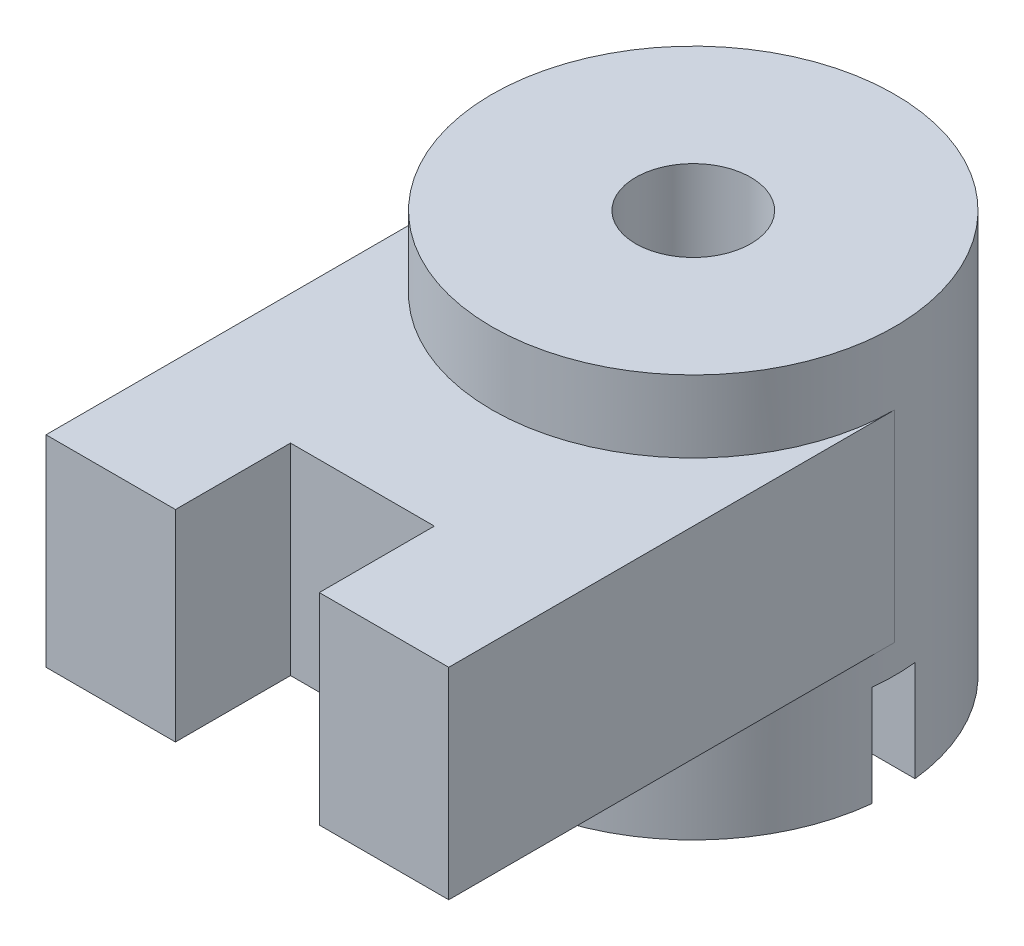
ISO-10303-21;
HEADER;
FILE_DESCRIPTION(('STEP AP214'),'2;1');
FILE_NAME('part.step','',(''),(''),'','','');
FILE_SCHEMA(('AUTOMOTIVE_DESIGN { 1 0 10303 214 1 1 1 1 }'));
ENDSEC;
DATA;
#1=APPLICATION_CONTEXT('core data for automotive mechanical design processes');
#2=APPLICATION_PROTOCOL_DEFINITION('international standard','automotive_design',2000,#1);
#3=PRODUCT_CONTEXT('',#1,'mechanical');
#4=PRODUCT('Part','Part','',(#3));
#5=PRODUCT_RELATED_PRODUCT_CATEGORY('part','',(#4));
#6=PRODUCT_DEFINITION_FORMATION('','',#4);
#7=PRODUCT_DEFINITION_CONTEXT('part definition',#1,'design');
#8=PRODUCT_DEFINITION('design','',#6,#7);
#9=PRODUCT_DEFINITION_SHAPE('','',#8);
#10=(LENGTH_UNIT() NAMED_UNIT(*) SI_UNIT(.MILLI.,.METRE.));
#11=(NAMED_UNIT(*) PLANE_ANGLE_UNIT() SI_UNIT($,.RADIAN.));
#12=(NAMED_UNIT(*) SI_UNIT($,.STERADIAN.) SOLID_ANGLE_UNIT());
#13=UNCERTAINTY_MEASURE_WITH_UNIT(LENGTH_MEASURE(1.E-05),#10,'distance_accuracy_value','');
#14=(GEOMETRIC_REPRESENTATION_CONTEXT(3) GLOBAL_UNCERTAINTY_ASSIGNED_CONTEXT((#13)) GLOBAL_UNIT_ASSIGNED_CONTEXT((#10,
#11,#12)) REPRESENTATION_CONTEXT('',''));
#15=CARTESIAN_POINT('',(0.,0.,0.));
#16=DIRECTION('',(0.,0.,1.));
#17=DIRECTION('',(1.,0.,0.));
#18=AXIS2_PLACEMENT_3D('',#15,#16,#17);
#19=CARTESIAN_POINT('',(70.,0.,155.));
#20=DIRECTION('',(0.,0.,1.));
#21=DIRECTION('',(0.,-1.,0.));
#22=AXIS2_PLACEMENT_3D('',#19,#20,#21);
#23=PLANE('',#22);
#24=DIRECTION('',(0.,1.,0.));
#25=VECTOR('',#24,1.);
#26=CARTESIAN_POINT('',(25.,0.,155.));
#27=LINE('',#26,#25);
#28=CARTESIAN_POINT('',(25.,45.,155.));
#29=VERTEX_POINT('',#28);
#30=CARTESIAN_POINT('',(25.,115.,155.));
#31=VERTEX_POINT('',#30);
#32=EDGE_CURVE('E42',#29,#31,#27,.T.);
#33=ORIENTED_EDGE('',*,*,#32,.F.);
#34=DIRECTION('',(-1.,0.,0.));
#35=VECTOR('',#34,1.);
#36=CARTESIAN_POINT('',(70.,45.,155.));
#37=LINE('',#36,#35);
#38=CARTESIAN_POINT('',(70.,45.,155.));
#39=VERTEX_POINT('',#38);
#40=EDGE_CURVE('E194',#39,#29,#37,.T.);
#41=ORIENTED_EDGE('',*,*,#40,.F.);
#42=DIRECTION('',(0.,1.,0.));
#43=VECTOR('',#42,1.);
#44=CARTESIAN_POINT('',(70.,0.,155.));
#45=LINE('',#44,#43);
#46=CARTESIAN_POINT('',(70.,115.,155.));
#47=VERTEX_POINT('',#46);
#48=EDGE_CURVE('E183',#39,#47,#45,.T.);
#49=ORIENTED_EDGE('',*,*,#48,.T.);
#50=DIRECTION('',(-1.,0.,0.));
#51=VECTOR('',#50,1.);
#52=CARTESIAN_POINT('',(70.,115.,155.));
#53=LINE('',#52,#51);
#54=EDGE_CURVE('E197',#47,#31,#53,.T.);
#55=ORIENTED_EDGE('',*,*,#54,.T.);
#56=EDGE_LOOP('',(#33,#41,#49,#55));
#57=FACE_BOUND('',#56,.T.);
#58=ADVANCED_FACE('F34',(#57),#23,.T.);
#59=CARTESIAN_POINT('',(0.,140.,0.));
#60=DIRECTION('',(0.,-1.,0.));
#61=DIRECTION('',(0.,0.,-1.));
#62=AXIS2_PLACEMENT_3D('',#59,#60,#61);
#63=CYLINDRICAL_SURFACE('',#62,70.);
#64=CARTESIAN_POINT('',(0.,0.,0.));
#65=DIRECTION('',(0.,1.,0.));
#66=DIRECTION('',(0.,0.,1.));
#67=AXIS2_PLACEMENT_3D('',#64,#65,#66);
#68=CIRCLE('',#67,70.);
#69=CARTESIAN_POINT('',(-69.5970545353753,0.,7.5));
#70=VERTEX_POINT('',#69);
#71=CARTESIAN_POINT('',(69.5970545353753,0.,7.5));
#72=VERTEX_POINT('',#71);
#73=EDGE_CURVE('E239',#70,#72,#68,.T.);
#74=ORIENTED_EDGE('',*,*,#73,.T.);
#75=DIRECTION('',(0.,-1.,0.));
#76=VECTOR('',#75,1.);
#77=CARTESIAN_POINT('',(69.5970545353753,140.,7.50000000000003));
#78=LINE('',#77,#76);
#79=CARTESIAN_POINT('',(69.5970545353753,35.,7.50000000000001));
#80=VERTEX_POINT('',#79);
#81=EDGE_CURVE('E218',#72,#80,#78,.F.);
#82=ORIENTED_EDGE('',*,*,#81,.T.);
#83=CARTESIAN_POINT('',(0.,35.,0.));
#84=DIRECTION('',(0.,1.,0.));
#85=DIRECTION('',(0.,0.,1.));
#86=AXIS2_PLACEMENT_3D('',#83,#84,#85);
#87=CIRCLE('',#86,70.);
#88=CARTESIAN_POINT('',(69.5970545353753,35.,-7.49999999999999));
#89=VERTEX_POINT('',#88);
#90=EDGE_CURVE('E212',#80,#89,#87,.T.);
#91=ORIENTED_EDGE('',*,*,#90,.T.);
#92=DIRECTION('',(0.,-1.,0.));
#93=VECTOR('',#92,1.);
#94=CARTESIAN_POINT('',(69.5970545353753,140.,-7.49999999999997));
#95=LINE('',#94,#93);
#96=CARTESIAN_POINT('',(69.5970545353753,0.,-7.5));
#97=VERTEX_POINT('',#96);
#98=EDGE_CURVE('E232',#89,#97,#95,.T.);
#99=ORIENTED_EDGE('',*,*,#98,.T.);
#100=CARTESIAN_POINT('',(-69.5970545353753,0.,-7.5));
#101=VERTEX_POINT('',#100);
#102=EDGE_CURVE('E247',#97,#101,#68,.T.);
#103=ORIENTED_EDGE('',*,*,#102,.T.);
#104=DIRECTION('',(0.,-1.,0.));
#105=VECTOR('',#104,1.);
#106=CARTESIAN_POINT('',(-69.5970545353753,140.,-7.49999999999997));
#107=LINE('',#106,#105);
#108=CARTESIAN_POINT('',(-69.5970545353753,35.,-7.49999999999999));
#109=VERTEX_POINT('',#108);
#110=EDGE_CURVE('E228',#101,#109,#107,.F.);
#111=ORIENTED_EDGE('',*,*,#110,.T.);
#112=CARTESIAN_POINT('',(-69.5970545353753,35.,7.50000000000001));
#113=VERTEX_POINT('',#112);
#114=EDGE_CURVE('E215',#109,#113,#87,.T.);
#115=ORIENTED_EDGE('',*,*,#114,.T.);
#116=DIRECTION('',(0.,-1.,0.));
#117=VECTOR('',#116,1.);
#118=CARTESIAN_POINT('',(-69.5970545353753,140.,7.50000000000003));
#119=LINE('',#118,#117);
#120=EDGE_CURVE('E222',#113,#70,#119,.T.);
#121=ORIENTED_EDGE('',*,*,#120,.T.);
#122=EDGE_LOOP('',(#74,#82,#91,#99,#103,#111,#115,#121));
#123=FACE_BOUND('',#122,.T.);
#124=CARTESIAN_POINT('',(0.,140.,0.));
#125=DIRECTION('',(0.,1.,0.));
#126=DIRECTION('',(0.,0.,1.));
#127=AXIS2_PLACEMENT_3D('',#124,#125,#126);
#128=CIRCLE('',#127,70.);
#129=CARTESIAN_POINT('',(0.,140.,70.));
#130=VERTEX_POINT('',#129);
#131=EDGE_CURVE('E243',#130,#130,#128,.T.);
#132=ORIENTED_EDGE('',*,*,#131,.F.);
#133=EDGE_LOOP('',(#132));
#134=FACE_BOUND('',#133,.T.);
#135=CARTESIAN_POINT('',(0.,45.,0.));
#136=DIRECTION('',(0.,1.,0.));
#137=DIRECTION('',(0.,0.,1.));
#138=AXIS2_PLACEMENT_3D('',#135,#136,#137);
#139=CIRCLE('',#138,70.);
#140=CARTESIAN_POINT('',(-70.,45.,0.));
#141=VERTEX_POINT('',#140);
#142=CARTESIAN_POINT('',(70.,45.,0.));
#143=VERTEX_POINT('',#142);
#144=EDGE_CURVE('E202',#141,#143,#139,.T.);
#145=ORIENTED_EDGE('',*,*,#144,.F.);
#146=DIRECTION('',(0.,-1.,0.));
#147=VECTOR('',#146,1.);
#148=CARTESIAN_POINT('',(-70.,0.,0.));
#149=LINE('',#148,#147);
#150=CARTESIAN_POINT('',(-70.,115.,0.));
#151=VERTEX_POINT('',#150);
#152=EDGE_CURVE('E170',#151,#141,#149,.T.);
#153=ORIENTED_EDGE('',*,*,#152,.F.);
#154=CARTESIAN_POINT('',(0.,115.,0.));
#155=DIRECTION('',(0.,1.,0.));
#156=DIRECTION('',(0.,0.,1.));
#157=AXIS2_PLACEMENT_3D('',#154,#155,#156);
#158=CIRCLE('',#157,70.);
#159=CARTESIAN_POINT('',(70.,115.,0.));
#160=VERTEX_POINT('',#159);
#161=EDGE_CURVE('E200',#151,#160,#158,.T.);
#162=ORIENTED_EDGE('',*,*,#161,.T.);
#163=DIRECTION('',(0.,-1.,0.));
#164=VECTOR('',#163,1.);
#165=CARTESIAN_POINT('',(70.,0.,0.));
#166=LINE('',#165,#164);
#167=EDGE_CURVE('E57',#160,#143,#166,.T.);
#168=ORIENTED_EDGE('',*,*,#167,.T.);
#169=EDGE_LOOP('',(#145,#153,#162,#168));
#170=FACE_BOUND('',#169,.T.);
#171=ADVANCED_FACE('F36',(#123,#134,#170),#63,.T.);
#172=CARTESIAN_POINT('',(0.,140.,0.));
#173=DIRECTION('',(0.,-1.,0.));
#174=DIRECTION('',(0.,0.,-1.));
#175=AXIS2_PLACEMENT_3D('',#172,#173,#174);
#176=CYLINDRICAL_SURFACE('',#175,20.);
#177=DIRECTION('',(0.,-1.,0.));
#178=VECTOR('',#177,1.);
#179=CARTESIAN_POINT('',(18.5404962177392,140.,-7.49999999999997));
#180=LINE('',#179,#178);
#181=CARTESIAN_POINT('',(18.5404962177392,35.,-7.49999999999999));
#182=VERTEX_POINT('',#181);
#183=CARTESIAN_POINT('',(18.5404962177392,0.,-7.49999999999997));
#184=VERTEX_POINT('',#183);
#185=EDGE_CURVE('E260',#182,#184,#180,.T.);
#186=ORIENTED_EDGE('',*,*,#185,.F.);
#187=CARTESIAN_POINT('',(0.,35.,0.));
#188=DIRECTION('',(0.,1.,0.));
#189=DIRECTION('',(0.,0.,1.));
#190=AXIS2_PLACEMENT_3D('',#187,#188,#189);
#191=CIRCLE('',#190,20.);
#192=CARTESIAN_POINT('',(18.5404962177392,35.,7.50000000000001));
#193=VERTEX_POINT('',#192);
#194=EDGE_CURVE('E252',#193,#182,#191,.T.);
#195=ORIENTED_EDGE('',*,*,#194,.F.);
#196=DIRECTION('',(0.,-1.,0.));
#197=VECTOR('',#196,1.);
#198=CARTESIAN_POINT('',(18.5404962177391,140.,7.50000000000003));
#199=LINE('',#198,#197);
#200=CARTESIAN_POINT('',(18.5404962177391,0.,7.50000000000003));
#201=VERTEX_POINT('',#200);
#202=EDGE_CURVE('E257',#201,#193,#199,.F.);
#203=ORIENTED_EDGE('',*,*,#202,.F.);
#204=CARTESIAN_POINT('',(0.,0.,0.));
#205=DIRECTION('',(0.,1.,0.));
#206=DIRECTION('',(0.,0.,1.));
#207=AXIS2_PLACEMENT_3D('',#204,#205,#206);
#208=CIRCLE('',#207,20.);
#209=CARTESIAN_POINT('',(-18.5404962177391,0.,7.50000000000003));
#210=VERTEX_POINT('',#209);
#211=EDGE_CURVE('E235',#210,#201,#208,.T.);
#212=ORIENTED_EDGE('',*,*,#211,.F.);
#213=DIRECTION('',(0.,-1.,0.));
#214=VECTOR('',#213,1.);
#215=CARTESIAN_POINT('',(-18.5404962177391,140.,7.50000000000003));
#216=LINE('',#215,#214);
#217=CARTESIAN_POINT('',(-18.5404962177392,35.,7.50000000000001));
#218=VERTEX_POINT('',#217);
#219=EDGE_CURVE('E251',#218,#210,#216,.T.);
#220=ORIENTED_EDGE('',*,*,#219,.F.);
#221=CARTESIAN_POINT('',(-18.5404962177392,35.,-7.49999999999999));
#222=VERTEX_POINT('',#221);
#223=EDGE_CURVE('E246',#222,#218,#191,.T.);
#224=ORIENTED_EDGE('',*,*,#223,.F.);
#225=DIRECTION('',(0.,-1.,0.));
#226=VECTOR('',#225,1.);
#227=CARTESIAN_POINT('',(-18.5404962177392,140.,-7.49999999999997));
#228=LINE('',#227,#226);
#229=CARTESIAN_POINT('',(-18.5404962177392,0.,-7.49999999999997));
#230=VERTEX_POINT('',#229);
#231=EDGE_CURVE('E254',#230,#222,#228,.F.);
#232=ORIENTED_EDGE('',*,*,#231,.F.);
#233=EDGE_CURVE('E240',#184,#230,#208,.T.);
#234=ORIENTED_EDGE('',*,*,#233,.F.);
#235=EDGE_LOOP('',(#186,#195,#203,#212,#220,#224,#232,#234));
#236=FACE_BOUND('',#235,.T.);
#237=CARTESIAN_POINT('',(0.,140.,0.));
#238=DIRECTION('',(0.,1.,0.));
#239=DIRECTION('',(0.,0.,1.));
#240=AXIS2_PLACEMENT_3D('',#237,#238,#239);
#241=CIRCLE('',#240,20.);
#242=CARTESIAN_POINT('',(0.,140.,20.));
#243=VERTEX_POINT('',#242);
#244=EDGE_CURVE('E236',#243,#243,#241,.T.);
#245=ORIENTED_EDGE('',*,*,#244,.T.);
#246=EDGE_LOOP('',(#245));
#247=FACE_BOUND('',#246,.T.);
#248=ADVANCED_FACE('F286',(#236,#247),#176,.F.);
#249=CARTESIAN_POINT('',(0.,0.,0.));
#250=DIRECTION('',(0.,1.,0.));
#251=DIRECTION('',(0.,0.,1.));
#252=AXIS2_PLACEMENT_3D('',#249,#250,#251);
#253=PLANE('',#252);
#254=ORIENTED_EDGE('',*,*,#102,.F.);
#255=DIRECTION('',(-1.,0.,0.));
#256=VECTOR('',#255,1.);
#257=CARTESIAN_POINT('',(0.,0.,-7.5));
#258=LINE('',#257,#256);
#259=EDGE_CURVE('E229',#97,#184,#258,.T.);
#260=ORIENTED_EDGE('',*,*,#259,.T.);
#261=ORIENTED_EDGE('',*,*,#233,.T.);
#262=EDGE_CURVE('E225',#230,#101,#258,.T.);
#263=ORIENTED_EDGE('',*,*,#262,.T.);
#264=EDGE_LOOP('',(#254,#260,#261,#263));
#265=FACE_BOUND('',#264,.T.);
#266=ADVANCED_FACE('F292',(#265),#253,.F.);
#267=CARTESIAN_POINT('',(0.,140.,0.));
#268=DIRECTION('',(0.,1.,0.));
#269=DIRECTION('',(0.,0.,1.));
#270=AXIS2_PLACEMENT_3D('',#267,#268,#269);
#271=PLANE('',#270);
#272=ORIENTED_EDGE('',*,*,#131,.T.);
#273=EDGE_LOOP('',(#272));
#274=FACE_BOUND('',#273,.T.);
#275=ORIENTED_EDGE('',*,*,#244,.F.);
#276=EDGE_LOOP('',(#275));
#277=FACE_BOUND('',#276,.T.);
#278=ADVANCED_FACE('F300',(#274,#277),#271,.T.);
#279=ORIENTED_EDGE('',*,*,#73,.F.);
#280=DIRECTION('',(1.,0.,0.));
#281=VECTOR('',#280,1.);
#282=CARTESIAN_POINT('',(0.,0.,7.5));
#283=LINE('',#282,#281);
#284=EDGE_CURVE('E219',#70,#210,#283,.T.);
#285=ORIENTED_EDGE('',*,*,#284,.T.);
#286=ORIENTED_EDGE('',*,*,#211,.T.);
#287=EDGE_CURVE('E214',#201,#72,#283,.T.);
#288=ORIENTED_EDGE('',*,*,#287,.T.);
#289=EDGE_LOOP('',(#279,#285,#286,#288));
#290=FACE_BOUND('',#289,.T.);
#291=ADVANCED_FACE('F303',(#290),#253,.F.);
#292=CARTESIAN_POINT('',(-70.,35.,7.50000000000001));
#293=DIRECTION('',(0.,1.,0.));
#294=DIRECTION('',(0.,0.,1.));
#295=AXIS2_PLACEMENT_3D('',#292,#293,#294);
#296=PLANE('',#295);
#297=DIRECTION('',(1.,0.,0.));
#298=VECTOR('',#297,1.);
#299=CARTESIAN_POINT('',(-70.,35.,-7.49999999999999));
#300=LINE('',#299,#298);
#301=EDGE_CURVE('E209',#109,#222,#300,.T.);
#302=ORIENTED_EDGE('',*,*,#301,.T.);
#303=ORIENTED_EDGE('',*,*,#223,.T.);
#304=DIRECTION('',(1.,0.,0.));
#305=VECTOR('',#304,1.);
#306=CARTESIAN_POINT('',(-70.,35.,7.50000000000001));
#307=LINE('',#306,#305);
#308=EDGE_CURVE('E208',#113,#218,#307,.T.);
#309=ORIENTED_EDGE('',*,*,#308,.F.);
#310=ORIENTED_EDGE('',*,*,#114,.F.);
#311=EDGE_LOOP('',(#302,#303,#309,#310));
#312=FACE_BOUND('',#311,.T.);
#313=ADVANCED_FACE('F311',(#312),#296,.F.);
#314=CARTESIAN_POINT('',(-70.,-35.,7.5));
#315=DIRECTION('',(0.,0.,1.));
#316=DIRECTION('',(0.,-1.,0.));
#317=AXIS2_PLACEMENT_3D('',#314,#315,#316);
#318=PLANE('',#317);
#319=ORIENTED_EDGE('',*,*,#308,.T.);
#320=ORIENTED_EDGE('',*,*,#219,.T.);
#321=ORIENTED_EDGE('',*,*,#284,.F.);
#322=ORIENTED_EDGE('',*,*,#120,.F.);
#323=EDGE_LOOP('',(#319,#320,#321,#322));
#324=FACE_BOUND('',#323,.T.);
#325=ADVANCED_FACE('F325',(#324),#318,.F.);
#326=CARTESIAN_POINT('',(-70.,-35.,-7.5));
#327=DIRECTION('',(0.,0.,-1.));
#328=DIRECTION('',(0.,1.,0.));
#329=AXIS2_PLACEMENT_3D('',#326,#327,#328);
#330=PLANE('',#329);
#331=ORIENTED_EDGE('',*,*,#262,.F.);
#332=ORIENTED_EDGE('',*,*,#231,.T.);
#333=ORIENTED_EDGE('',*,*,#301,.F.);
#334=ORIENTED_EDGE('',*,*,#110,.F.);
#335=EDGE_LOOP('',(#331,#332,#333,#334));
#336=FACE_BOUND('',#335,.T.);
#337=ADVANCED_FACE('F319',(#336),#330,.F.);
#338=EDGE_CURVE('E204',#182,#89,#300,.T.);
#339=ORIENTED_EDGE('',*,*,#338,.F.);
#340=ORIENTED_EDGE('',*,*,#185,.T.);
#341=ORIENTED_EDGE('',*,*,#259,.F.);
#342=ORIENTED_EDGE('',*,*,#98,.F.);
#343=EDGE_LOOP('',(#339,#340,#341,#342));
#344=FACE_BOUND('',#343,.T.);
#345=ADVANCED_FACE('F315',(#344),#330,.F.);
#346=ORIENTED_EDGE('',*,*,#287,.F.);
#347=ORIENTED_EDGE('',*,*,#202,.T.);
#348=EDGE_CURVE('E205',#193,#80,#307,.T.);
#349=ORIENTED_EDGE('',*,*,#348,.T.);
#350=ORIENTED_EDGE('',*,*,#81,.F.);
#351=EDGE_LOOP('',(#346,#347,#349,#350));
#352=FACE_BOUND('',#351,.T.);
#353=ADVANCED_FACE('F318',(#352),#318,.F.);
#354=ORIENTED_EDGE('',*,*,#348,.F.);
#355=ORIENTED_EDGE('',*,*,#194,.T.);
#356=ORIENTED_EDGE('',*,*,#338,.T.);
#357=ORIENTED_EDGE('',*,*,#90,.F.);
#358=EDGE_LOOP('',(#354,#355,#356,#357));
#359=FACE_BOUND('',#358,.T.);
#360=ADVANCED_FACE('F321',(#359),#296,.F.);
#361=CARTESIAN_POINT('',(70.,45.,0.));
#362=DIRECTION('',(0.,1.,0.));
#363=DIRECTION('',(0.,0.,1.));
#364=AXIS2_PLACEMENT_3D('',#361,#362,#363);
#365=PLANE('',#364);
#366=ORIENTED_EDGE('',*,*,#40,.T.);
#367=DIRECTION('',(0.,0.,-1.));
#368=VECTOR('',#367,1.);
#369=CARTESIAN_POINT('',(25.,45.,0.));
#370=LINE('',#369,#368);
#371=CARTESIAN_POINT('',(25.,45.,115.));
#372=VERTEX_POINT('',#371);
#373=EDGE_CURVE('E166',#29,#372,#370,.T.);
#374=ORIENTED_EDGE('',*,*,#373,.T.);
#375=DIRECTION('',(-1.,0.,0.));
#376=VECTOR('',#375,1.);
#377=CARTESIAN_POINT('',(70.,45.,115.));
#378=LINE('',#377,#376);
#379=CARTESIAN_POINT('',(-25.,45.,115.));
#380=VERTEX_POINT('',#379);
#381=EDGE_CURVE('E158',#372,#380,#378,.T.);
#382=ORIENTED_EDGE('',*,*,#381,.T.);
#383=DIRECTION('',(0.,0.,1.));
#384=VECTOR('',#383,1.);
#385=CARTESIAN_POINT('',(-25.,45.,0.));
#386=LINE('',#385,#384);
#387=CARTESIAN_POINT('',(-25.,45.,155.));
#388=VERTEX_POINT('',#387);
#389=EDGE_CURVE('E145',#380,#388,#386,.T.);
#390=ORIENTED_EDGE('',*,*,#389,.T.);
#391=CARTESIAN_POINT('',(-70.,45.,155.));
#392=VERTEX_POINT('',#391);
#393=EDGE_CURVE('E185',#388,#392,#37,.T.);
#394=ORIENTED_EDGE('',*,*,#393,.T.);
#395=DIRECTION('',(0.,0.,-1.));
#396=VECTOR('',#395,1.);
#397=CARTESIAN_POINT('',(-70.,45.,0.));
#398=LINE('',#397,#396);
#399=EDGE_CURVE('E167',#392,#141,#398,.T.);
#400=ORIENTED_EDGE('',*,*,#399,.T.);
#401=ORIENTED_EDGE('',*,*,#144,.T.);
#402=DIRECTION('',(0.,0.,-1.));
#403=VECTOR('',#402,1.);
#404=CARTESIAN_POINT('',(70.,45.,0.));
#405=LINE('',#404,#403);
#406=EDGE_CURVE('E175',#39,#143,#405,.T.);
#407=ORIENTED_EDGE('',*,*,#406,.F.);
#408=EDGE_LOOP('',(#366,#374,#382,#390,#394,#400,#401,#407));
#409=FACE_BOUND('',#408,.T.);
#410=ADVANCED_FACE('F165',(#409),#365,.F.);
#411=CARTESIAN_POINT('',(70.,115.,0.));
#412=DIRECTION('',(0.,1.,0.));
#413=DIRECTION('',(0.,0.,1.));
#414=AXIS2_PLACEMENT_3D('',#411,#412,#413);
#415=PLANE('',#414);
#416=DIRECTION('',(0.,0.,-1.));
#417=VECTOR('',#416,1.);
#418=CARTESIAN_POINT('',(25.,115.,0.));
#419=LINE('',#418,#417);
#420=CARTESIAN_POINT('',(25.,115.,115.));
#421=VERTEX_POINT('',#420);
#422=EDGE_CURVE('E153',#31,#421,#419,.T.);
#423=ORIENTED_EDGE('',*,*,#422,.F.);
#424=ORIENTED_EDGE('',*,*,#54,.F.);
#425=DIRECTION('',(0.,0.,-1.));
#426=VECTOR('',#425,1.);
#427=CARTESIAN_POINT('',(70.,115.,0.));
#428=LINE('',#427,#426);
#429=EDGE_CURVE('E180',#47,#160,#428,.T.);
#430=ORIENTED_EDGE('',*,*,#429,.T.);
#431=ORIENTED_EDGE('',*,*,#161,.F.);
#432=DIRECTION('',(0.,0.,-1.));
#433=VECTOR('',#432,1.);
#434=CARTESIAN_POINT('',(-70.,115.,0.));
#435=LINE('',#434,#433);
#436=CARTESIAN_POINT('',(-70.,115.,155.));
#437=VERTEX_POINT('',#436);
#438=EDGE_CURVE('E189',#437,#151,#435,.T.);
#439=ORIENTED_EDGE('',*,*,#438,.F.);
#440=CARTESIAN_POINT('',(-25.,115.,155.));
#441=VERTEX_POINT('',#440);
#442=EDGE_CURVE('E196',#441,#437,#53,.T.);
#443=ORIENTED_EDGE('',*,*,#442,.F.);
#444=DIRECTION('',(0.,0.,1.));
#445=VECTOR('',#444,1.);
#446=CARTESIAN_POINT('',(-25.,115.,0.));
#447=LINE('',#446,#445);
#448=CARTESIAN_POINT('',(-25.,115.,115.));
#449=VERTEX_POINT('',#448);
#450=EDGE_CURVE('E49',#449,#441,#447,.T.);
#451=ORIENTED_EDGE('',*,*,#450,.F.);
#452=DIRECTION('',(-1.,0.,0.));
#453=VECTOR('',#452,1.);
#454=CARTESIAN_POINT('',(70.,115.,115.));
#455=LINE('',#454,#453);
#456=EDGE_CURVE('E11',#421,#449,#455,.T.);
#457=ORIENTED_EDGE('',*,*,#456,.F.);
#458=EDGE_LOOP('',(#423,#424,#430,#431,#439,#443,#451,#457));
#459=FACE_BOUND('',#458,.T.);
#460=ADVANCED_FACE('F268',(#459),#415,.T.);
#461=DIRECTION('',(0.,-1.,0.));
#462=VECTOR('',#461,1.);
#463=CARTESIAN_POINT('',(-25.,0.,155.));
#464=LINE('',#463,#462);
#465=EDGE_CURVE('E149',#441,#388,#464,.T.);
#466=ORIENTED_EDGE('',*,*,#465,.F.);
#467=ORIENTED_EDGE('',*,*,#442,.T.);
#468=DIRECTION('',(0.,1.,0.));
#469=VECTOR('',#468,1.);
#470=CARTESIAN_POINT('',(-70.,0.,155.));
#471=LINE('',#470,#469);
#472=EDGE_CURVE('E178',#392,#437,#471,.T.);
#473=ORIENTED_EDGE('',*,*,#472,.F.);
#474=ORIENTED_EDGE('',*,*,#393,.F.);
#475=EDGE_LOOP('',(#466,#467,#473,#474));
#476=FACE_BOUND('',#475,.T.);
#477=ADVANCED_FACE('F282',(#476),#23,.T.);
#478=CARTESIAN_POINT('',(70.,0.,0.));
#479=DIRECTION('',(1.,0.,0.));
#480=DIRECTION('',(0.,0.,-1.));
#481=AXIS2_PLACEMENT_3D('',#478,#479,#480);
#482=PLANE('',#481);
#483=ORIENTED_EDGE('',*,*,#406,.T.);
#484=ORIENTED_EDGE('',*,*,#167,.F.);
#485=ORIENTED_EDGE('',*,*,#429,.F.);
#486=ORIENTED_EDGE('',*,*,#48,.F.);
#487=EDGE_LOOP('',(#483,#484,#485,#486));
#488=FACE_BOUND('',#487,.T.);
#489=ADVANCED_FACE('F273',(#488),#482,.T.);
#490=CARTESIAN_POINT('',(-70.,0.,0.));
#491=DIRECTION('',(1.,0.,0.));
#492=DIRECTION('',(0.,0.,-1.));
#493=AXIS2_PLACEMENT_3D('',#490,#491,#492);
#494=PLANE('',#493);
#495=ORIENTED_EDGE('',*,*,#399,.F.);
#496=ORIENTED_EDGE('',*,*,#472,.T.);
#497=ORIENTED_EDGE('',*,*,#438,.T.);
#498=ORIENTED_EDGE('',*,*,#152,.T.);
#499=EDGE_LOOP('',(#495,#496,#497,#498));
#500=FACE_BOUND('',#499,.T.);
#501=ADVANCED_FACE('F279',(#500),#494,.F.);
#502=CARTESIAN_POINT('',(-25.,0.,115.));
#503=DIRECTION('',(0.,0.,-1.));
#504=DIRECTION('',(-1.,0.,0.));
#505=AXIS2_PLACEMENT_3D('',#502,#503,#504);
#506=PLANE('',#505);
#507=DIRECTION('',(0.,1.,0.));
#508=VECTOR('',#507,1.);
#509=CARTESIAN_POINT('',(25.,0.,115.));
#510=LINE('',#509,#508);
#511=EDGE_CURVE('E161',#372,#421,#510,.T.);
#512=ORIENTED_EDGE('',*,*,#511,.T.);
#513=ORIENTED_EDGE('',*,*,#456,.T.);
#514=DIRECTION('',(0.,1.,0.));
#515=VECTOR('',#514,1.);
#516=CARTESIAN_POINT('',(-25.,0.,115.));
#517=LINE('',#516,#515);
#518=EDGE_CURVE('E148',#380,#449,#517,.T.);
#519=ORIENTED_EDGE('',*,*,#518,.F.);
#520=ORIENTED_EDGE('',*,*,#381,.F.);
#521=EDGE_LOOP('',(#512,#513,#519,#520));
#522=FACE_BOUND('',#521,.T.);
#523=ADVANCED_FACE('F157',(#522),#506,.F.);
#524=CARTESIAN_POINT('',(25.,0.,195.));
#525=DIRECTION('',(1.,0.,0.));
#526=DIRECTION('',(0.,0.,-1.));
#527=AXIS2_PLACEMENT_3D('',#524,#525,#526);
#528=PLANE('',#527);
#529=ORIENTED_EDGE('',*,*,#32,.T.);
#530=ORIENTED_EDGE('',*,*,#422,.T.);
#531=ORIENTED_EDGE('',*,*,#511,.F.);
#532=ORIENTED_EDGE('',*,*,#373,.F.);
#533=EDGE_LOOP('',(#529,#530,#531,#532));
#534=FACE_BOUND('',#533,.T.);
#535=ADVANCED_FACE('F265',(#534),#528,.F.);
#536=CARTESIAN_POINT('',(-25.,0.,195.));
#537=DIRECTION('',(-1.,0.,0.));
#538=DIRECTION('',(0.,0.,1.));
#539=AXIS2_PLACEMENT_3D('',#536,#537,#538);
#540=PLANE('',#539);
#541=ORIENTED_EDGE('',*,*,#518,.T.);
#542=ORIENTED_EDGE('',*,*,#450,.T.);
#543=ORIENTED_EDGE('',*,*,#465,.T.);
#544=ORIENTED_EDGE('',*,*,#389,.F.);
#545=EDGE_LOOP('',(#541,#542,#543,#544));
#546=FACE_BOUND('',#545,.T.);
#547=ADVANCED_FACE('F147',(#546),#540,.F.);
#548=CLOSED_SHELL('',(#58,#171,#248,#266,#278,#291,#313,#325,#337,#345,#353,#360,#410,#460,#477,
#489,#501,#523,#535,#547));
#549=MANIFOLD_SOLID_BREP('B2',#548);
#550=ADVANCED_BREP_SHAPE_REPRESENTATION('',(#18,#549),#14);
#551=SHAPE_DEFINITION_REPRESENTATION(#9,#550);
ENDSEC;
END-ISO-10303-21;
